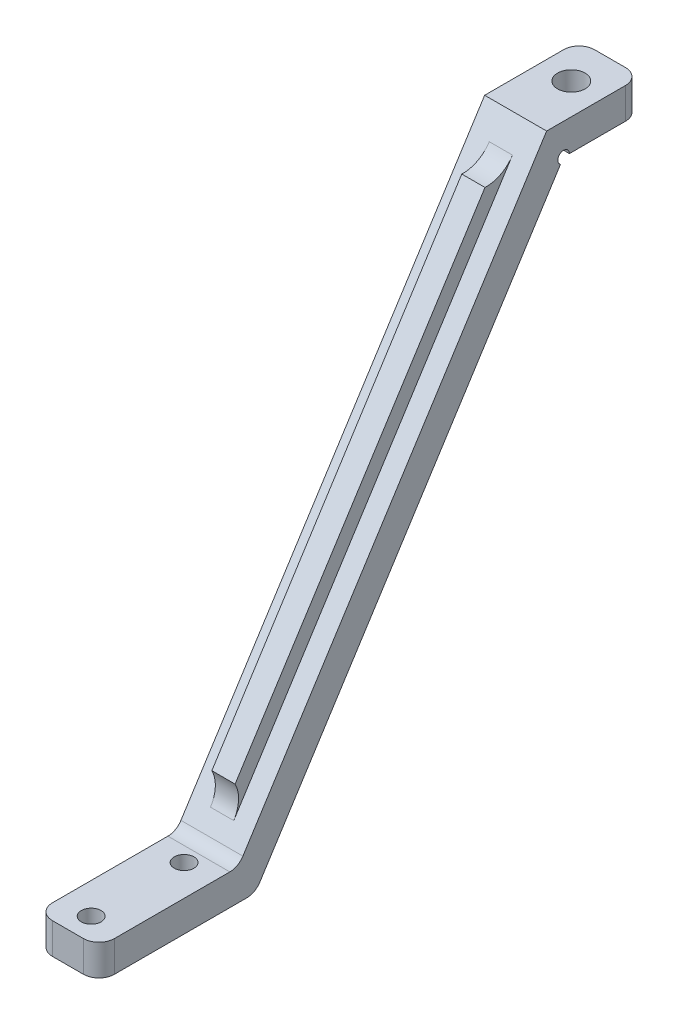
ISO-10303-21;
HEADER;
FILE_DESCRIPTION(('STEP AP214'),'2;1');
FILE_NAME('part.step','',(''),(''),'','','');
FILE_SCHEMA(('AUTOMOTIVE_DESIGN { 1 0 10303 214 1 1 1 1 }'));
ENDSEC;
DATA;
#1=APPLICATION_CONTEXT('core data for automotive mechanical design processes');
#2=APPLICATION_PROTOCOL_DEFINITION('international standard','automotive_design',2000,#1);
#3=PRODUCT_CONTEXT('',#1,'mechanical');
#4=PRODUCT('Part','Part','',(#3));
#5=PRODUCT_RELATED_PRODUCT_CATEGORY('part','',(#4));
#6=PRODUCT_DEFINITION_FORMATION('','',#4);
#7=PRODUCT_DEFINITION_CONTEXT('part definition',#1,'design');
#8=PRODUCT_DEFINITION('design','',#6,#7);
#9=PRODUCT_DEFINITION_SHAPE('','',#8);
#10=(LENGTH_UNIT() NAMED_UNIT(*) SI_UNIT(.MILLI.,.METRE.));
#11=(NAMED_UNIT(*) PLANE_ANGLE_UNIT() SI_UNIT($,.RADIAN.));
#12=(NAMED_UNIT(*) SI_UNIT($,.STERADIAN.) SOLID_ANGLE_UNIT());
#13=UNCERTAINTY_MEASURE_WITH_UNIT(LENGTH_MEASURE(1.E-05),#10,'distance_accuracy_value','');
#14=(GEOMETRIC_REPRESENTATION_CONTEXT(3) GLOBAL_UNCERTAINTY_ASSIGNED_CONTEXT((#13)) GLOBAL_UNIT_ASSIGNED_CONTEXT((#10,
#11,#12)) REPRESENTATION_CONTEXT('',''));
#15=CARTESIAN_POINT('',(0.,0.,0.));
#16=DIRECTION('',(0.,0.,1.));
#17=DIRECTION('',(1.,0.,0.));
#18=AXIS2_PLACEMENT_3D('',#15,#16,#17);
#19=CARTESIAN_POINT('',(4.,58.4,-42.));
#20=DIRECTION('',(0.,0.537817877143923,0.843061048219169));
#21=DIRECTION('',(0.,-0.843061048219169,0.537817877143923));
#22=AXIS2_PLACEMENT_3D('',#19,#20,#21);
#23=PLANE('',#22);
#24=DIRECTION('',(0.,0.843061048219169,-0.537817877143923));
#25=VECTOR('',#24,1.);
#26=CARTESIAN_POINT('',(4.,58.4,-42.));
#27=LINE('',#26,#25);
#28=CARTESIAN_POINT('',(4.,-3.07563575428783,-2.78256018673409));
#29=VERTEX_POINT('',#28);
#30=CARTESIAN_POINT('',(4.,57.7677042138356,-41.5966365921421));
#31=VERTEX_POINT('',#30);
#32=EDGE_CURVE('E431',#29,#31,#27,.T.);
#33=ORIENTED_EDGE('',*,*,#32,.F.);
#34=DIRECTION('',(-1.,0.,0.));
#35=VECTOR('',#34,1.);
#36=CARTESIAN_POINT('',(4.,-3.07563575428783,-2.78256018673409));
#37=LINE('',#36,#35);
#38=CARTESIAN_POINT('',(-4.,-3.07563575428783,-2.78256018673409));
#39=VERTEX_POINT('',#38);
#40=EDGE_CURVE('E385',#29,#39,#37,.T.);
#41=ORIENTED_EDGE('',*,*,#40,.T.);
#42=DIRECTION('',(0.,0.843061048219169,-0.537817877143923));
#43=VECTOR('',#42,1.);
#44=CARTESIAN_POINT('',(-4.,58.4,-42.));
#45=LINE('',#44,#43);
#46=CARTESIAN_POINT('',(-4.,57.7677042138356,-41.5966365921421));
#47=VERTEX_POINT('',#46);
#48=EDGE_CURVE('E228',#39,#47,#45,.T.);
#49=ORIENTED_EDGE('',*,*,#48,.T.);
#50=DIRECTION('',(1.,0.,0.));
#51=VECTOR('',#50,1.);
#52=CARTESIAN_POINT('',(-4.,57.7677042138356,-41.5966365921421));
#53=LINE('',#52,#51);
#54=EDGE_CURVE('E207',#47,#31,#53,.T.);
#55=ORIENTED_EDGE('',*,*,#54,.T.);
#56=EDGE_LOOP('',(#33,#41,#49,#55));
#57=FACE_BOUND('',#56,.T.);
#58=DIRECTION('',(0.,-0.843061048219169,0.537817877143923));
#59=VECTOR('',#58,1.);
#60=CARTESIAN_POINT('',(-1.5,3.75689704484922,-7.14126978826324));
#61=LINE('',#60,#59);
#62=CARTESIAN_POINT('',(-1.5,57.2610090767951,-41.2733981937629));
#63=VERTEX_POINT('',#62);
#64=CARTESIAN_POINT('',(-1.5,0.836447906053474,-5.27821401139901));
#65=VERTEX_POINT('',#64);
#66=EDGE_CURVE('E475',#63,#65,#61,.T.);
#67=ORIENTED_EDGE('',*,*,#66,.T.);
#68=DIRECTION('',(1.,0.,0.));
#69=VECTOR('',#68,1.);
#70=CARTESIAN_POINT('',(4.,0.836447906053466,-5.27821401139901));
#71=LINE('',#70,#69);
#72=CARTESIAN_POINT('',(1.5,0.836447906053471,-5.27821401139902));
#73=VERTEX_POINT('',#72);
#74=EDGE_CURVE('E285',#65,#73,#71,.T.);
#75=ORIENTED_EDGE('',*,*,#74,.T.);
#76=DIRECTION('',(0.,-0.843061048219169,0.537817877143923));
#77=VECTOR('',#76,1.);
#78=CARTESIAN_POINT('',(1.5,3.75689704484922,-7.14126978826324));
#79=LINE('',#78,#77);
#80=CARTESIAN_POINT('',(1.5,57.2610090767952,-41.2733981937629));
#81=VERTEX_POINT('',#80);
#82=EDGE_CURVE('E476',#81,#73,#79,.T.);
#83=ORIENTED_EDGE('',*,*,#82,.F.);
#84=DIRECTION('',(-1.,0.,0.));
#85=VECTOR('',#84,1.);
#86=CARTESIAN_POINT('',(4.,57.2610090767951,-41.2733981937629));
#87=LINE('',#86,#85);
#88=EDGE_CURVE('E266',#81,#63,#87,.T.);
#89=ORIENTED_EDGE('',*,*,#88,.T.);
#90=EDGE_LOOP('',(#67,#75,#83,#89));
#91=FACE_BOUND('',#90,.T.);
#92=ADVANCED_FACE('F43',(#57,#91),#23,.F.);
#93=CARTESIAN_POINT('',(4.,0.,0.));
#94=DIRECTION('',(0.,-0.537817877143923,-0.843061048219169));
#95=DIRECTION('',(0.,0.843061048219169,-0.537817877143923));
#96=AXIS2_PLACEMENT_3D('',#93,#94,#95);
#97=PLANE('',#96);
#98=DIRECTION('',(0.,-0.843061048219169,0.537817877143923));
#99=VECTOR('',#98,1.);
#100=CARTESIAN_POINT('',(-4.,0.,0.));
#101=LINE('',#100,#99);
#102=CARTESIAN_POINT('',(-4.,62.4,-39.8071238194085));
#103=VERTEX_POINT('',#102);
#104=CARTESIAN_POINT('',(-4.,0.924364245712154,-0.589684006142594));
#105=VERTEX_POINT('',#104);
#106=EDGE_CURVE('E232',#103,#105,#101,.T.);
#107=ORIENTED_EDGE('',*,*,#106,.T.);
#108=DIRECTION('',(-1.,0.,0.));
#109=VECTOR('',#108,1.);
#110=CARTESIAN_POINT('',(4.,0.924364245712154,-0.589684006142594));
#111=LINE('',#110,#109);
#112=CARTESIAN_POINT('',(4.,0.924364245712154,-0.589684006142594));
#113=VERTEX_POINT('',#112);
#114=EDGE_CURVE('E382',#105,#113,#111,.F.);
#115=ORIENTED_EDGE('',*,*,#114,.T.);
#116=DIRECTION('',(0.,-0.843061048219169,0.537817877143923));
#117=VECTOR('',#116,1.);
#118=CARTESIAN_POINT('',(4.,0.,0.));
#119=LINE('',#118,#117);
#120=CARTESIAN_POINT('',(4.,62.4,-39.8071238194085));
#121=VERTEX_POINT('',#120);
#122=EDGE_CURVE('E412',#121,#113,#119,.T.);
#123=ORIENTED_EDGE('',*,*,#122,.F.);
#124=DIRECTION('',(-1.,0.,0.));
#125=VECTOR('',#124,1.);
#126=CARTESIAN_POINT('',(4.,62.4,-39.8071238194085));
#127=LINE('',#126,#125);
#128=EDGE_CURVE('E249',#121,#103,#127,.T.);
#129=ORIENTED_EDGE('',*,*,#128,.T.);
#130=EDGE_LOOP('',(#107,#115,#123,#129));
#131=FACE_BOUND('',#130,.T.);
#132=DIRECTION('',(-1.,0.,0.));
#133=VECTOR('',#132,1.);
#134=CARTESIAN_POINT('',(4.,2.98771941462919,-1.90596981852236));
#135=LINE('',#134,#133);
#136=CARTESIAN_POINT('',(1.5,2.9877194146292,-1.90596981852235));
#137=VERTEX_POINT('',#136);
#138=CARTESIAN_POINT('',(-1.5,2.98771941462919,-1.90596981852236));
#139=VERTEX_POINT('',#138);
#140=EDGE_CURVE('E293',#137,#139,#135,.T.);
#141=ORIENTED_EDGE('',*,*,#140,.T.);
#142=DIRECTION('',(0.,0.843061048219169,-0.537817877143923));
#143=VECTOR('',#142,1.);
#144=CARTESIAN_POINT('',(-1.5,56.4918314465751,-36.0380982240219));
#145=LINE('',#144,#143);
#146=CARTESIAN_POINT('',(-1.5,59.4122805853708,-37.9011540008862));
#147=VERTEX_POINT('',#146);
#148=EDGE_CURVE('E479',#139,#147,#145,.T.);
#149=ORIENTED_EDGE('',*,*,#148,.T.);
#150=DIRECTION('',(1.,0.,0.));
#151=VECTOR('',#150,1.);
#152=CARTESIAN_POINT('',(4.,59.4122805853708,-37.9011540008862));
#153=LINE('',#152,#151);
#154=CARTESIAN_POINT('',(1.5,59.4122805853708,-37.9011540008862));
#155=VERTEX_POINT('',#154);
#156=EDGE_CURVE('E289',#147,#155,#153,.T.);
#157=ORIENTED_EDGE('',*,*,#156,.T.);
#158=DIRECTION('',(0.,0.843061048219169,-0.537817877143923));
#159=VECTOR('',#158,1.);
#160=CARTESIAN_POINT('',(1.5,56.4918314465751,-36.0380982240219));
#161=LINE('',#160,#159);
#162=EDGE_CURVE('E484',#137,#155,#161,.T.);
#163=ORIENTED_EDGE('',*,*,#162,.F.);
#164=EDGE_LOOP('',(#141,#149,#157,#163));
#165=FACE_BOUND('',#164,.T.);
#166=ADVANCED_FACE('F402',(#131,#165),#97,.F.);
#167=CARTESIAN_POINT('',(4.,-4.,18.));
#168=DIRECTION('',(0.,0.,-1.));
#169=DIRECTION('',(-1.,0.,0.));
#170=AXIS2_PLACEMENT_3D('',#167,#168,#169);
#171=PLANE('',#170);
#172=DIRECTION('',(-1.,0.,0.));
#173=VECTOR('',#172,1.);
#174=CARTESIAN_POINT('',(4.,0.,18.));
#175=LINE('',#174,#173);
#176=CARTESIAN_POINT('',(2.,0.,18.));
#177=VERTEX_POINT('',#176);
#178=CARTESIAN_POINT('',(-2.,0.,18.));
#179=VERTEX_POINT('',#178);
#180=EDGE_CURVE('E245',#177,#179,#175,.T.);
#181=ORIENTED_EDGE('',*,*,#180,.T.);
#182=DIRECTION('',(0.,-1.,0.));
#183=VECTOR('',#182,1.);
#184=CARTESIAN_POINT('',(-2.,-4.,18.));
#185=LINE('',#184,#183);
#186=CARTESIAN_POINT('',(-2.,-4.,18.));
#187=VERTEX_POINT('',#186);
#188=EDGE_CURVE('E328',#179,#187,#185,.T.);
#189=ORIENTED_EDGE('',*,*,#188,.T.);
#190=DIRECTION('',(-1.,0.,0.));
#191=VECTOR('',#190,1.);
#192=CARTESIAN_POINT('',(4.,-4.,18.));
#193=LINE('',#192,#191);
#194=CARTESIAN_POINT('',(2.,-4.,18.));
#195=VERTEX_POINT('',#194);
#196=EDGE_CURVE('E262',#195,#187,#193,.T.);
#197=ORIENTED_EDGE('',*,*,#196,.F.);
#198=DIRECTION('',(0.,-1.,0.));
#199=VECTOR('',#198,1.);
#200=CARTESIAN_POINT('',(2.,-4.,18.));
#201=LINE('',#200,#199);
#202=EDGE_CURVE('E325',#195,#177,#201,.F.);
#203=ORIENTED_EDGE('',*,*,#202,.T.);
#204=EDGE_LOOP('',(#181,#189,#197,#203));
#205=FACE_BOUND('',#204,.T.);
#206=ADVANCED_FACE('F538',(#205),#171,.F.);
#207=CARTESIAN_POINT('',(4.,-4.,-2.19287618059149));
#208=DIRECTION('',(0.,1.,0.));
#209=DIRECTION('',(0.,0.,1.));
#210=AXIS2_PLACEMENT_3D('',#207,#208,#209);
#211=PLANE('',#210);
#212=CARTESIAN_POINT('',(0.,-4.,3.));
#213=DIRECTION('',(0.,1.,0.));
#214=DIRECTION('',(0.,0.,1.));
#215=AXIS2_PLACEMENT_3D('',#212,#213,#214);
#216=CIRCLE('',#215,1.275);
#217=CARTESIAN_POINT('',(0.,-4.,4.275));
#218=VERTEX_POINT('',#217);
#219=EDGE_CURVE('E272',#218,#218,#216,.T.);
#220=ORIENTED_EDGE('',*,*,#219,.T.);
#221=EDGE_LOOP('',(#220));
#222=FACE_BOUND('',#221,.T.);
#223=CARTESIAN_POINT('',(0.,-4.,15.));
#224=DIRECTION('',(0.,1.,0.));
#225=DIRECTION('',(0.,0.,1.));
#226=AXIS2_PLACEMENT_3D('',#223,#224,#225);
#227=CIRCLE('',#226,1.275);
#228=CARTESIAN_POINT('',(0.,-4.,16.275));
#229=VERTEX_POINT('',#228);
#230=EDGE_CURVE('E506',#229,#229,#227,.T.);
#231=ORIENTED_EDGE('',*,*,#230,.T.);
#232=EDGE_LOOP('',(#231));
#233=FACE_BOUND('',#232,.T.);
#234=DIRECTION('',(0.,0.,-1.));
#235=VECTOR('',#234,1.);
#236=CARTESIAN_POINT('',(-4.,-4.,-2.19287618059149));
#237=LINE('',#236,#235);
#238=CARTESIAN_POINT('',(-4.,-4.,16.));
#239=VERTEX_POINT('',#238);
#240=CARTESIAN_POINT('',(-4.,-4.,-1.09643809029575));
#241=VERTEX_POINT('',#240);
#242=EDGE_CURVE('E234',#239,#241,#237,.T.);
#243=ORIENTED_EDGE('',*,*,#242,.T.);
#244=DIRECTION('',(-1.,0.,0.));
#245=VECTOR('',#244,1.);
#246=CARTESIAN_POINT('',(4.,-4.,-1.09643809029575));
#247=LINE('',#246,#245);
#248=CARTESIAN_POINT('',(4.,-4.,-1.09643809029575));
#249=VERTEX_POINT('',#248);
#250=EDGE_CURVE('E59',#241,#249,#247,.F.);
#251=ORIENTED_EDGE('',*,*,#250,.T.);
#252=DIRECTION('',(0.,0.,-1.));
#253=VECTOR('',#252,1.);
#254=CARTESIAN_POINT('',(4.,-4.,-2.19287618059149));
#255=LINE('',#254,#253);
#256=CARTESIAN_POINT('',(4.,-4.,16.));
#257=VERTEX_POINT('',#256);
#258=EDGE_CURVE('E244',#257,#249,#255,.T.);
#259=ORIENTED_EDGE('',*,*,#258,.F.);
#260=CARTESIAN_POINT('',(2.,-4.,16.));
#261=DIRECTION('',(0.,1.,0.));
#262=DIRECTION('',(0.,0.,1.));
#263=AXIS2_PLACEMENT_3D('',#260,#261,#262);
#264=CIRCLE('',#263,2.);
#265=EDGE_CURVE('E332',#257,#195,#264,.F.);
#266=ORIENTED_EDGE('',*,*,#265,.T.);
#267=ORIENTED_EDGE('',*,*,#196,.T.);
#268=CARTESIAN_POINT('',(-2.,-4.,16.));
#269=DIRECTION('',(0.,1.,0.));
#270=DIRECTION('',(0.,0.,1.));
#271=AXIS2_PLACEMENT_3D('',#268,#269,#270);
#272=CIRCLE('',#271,2.);
#273=EDGE_CURVE('E335',#187,#239,#272,.F.);
#274=ORIENTED_EDGE('',*,*,#273,.T.);
#275=EDGE_LOOP('',(#243,#251,#259,#266,#267,#274));
#276=FACE_BOUND('',#275,.T.);
#277=ADVANCED_FACE('F425',(#222,#233,#276),#211,.F.);
#278=CARTESIAN_POINT('',(4.,58.4,-52.));
#279=DIRECTION('',(0.,1.,0.));
#280=DIRECTION('',(0.,0.,1.));
#281=AXIS2_PLACEMENT_3D('',#278,#279,#280);
#282=PLANE('',#281);
#283=CARTESIAN_POINT('',(-4.71844785465692E-13,58.4,-46.9999999999993));
#284=DIRECTION('',(0.,1.,0.));
#285=DIRECTION('',(0.,0.,1.));
#286=AXIS2_PLACEMENT_3D('',#283,#284,#285);
#287=CIRCLE('',#286,1.7749999999994);
#288=CARTESIAN_POINT('',(-4.71844785465692E-13,58.4,-45.2249999999999));
#289=VERTEX_POINT('',#288);
#290=EDGE_CURVE('E280',#289,#289,#287,.T.);
#291=ORIENTED_EDGE('',*,*,#290,.T.);
#292=EDGE_LOOP('',(#291));
#293=FACE_BOUND('',#292,.T.);
#294=DIRECTION('',(0.,0.,-1.));
#295=VECTOR('',#294,1.);
#296=CARTESIAN_POINT('',(-4.,58.4,-52.));
#297=LINE('',#296,#295);
#298=CARTESIAN_POINT('',(-4.,58.4,-42.75));
#299=VERTEX_POINT('',#298);
#300=CARTESIAN_POINT('',(-4.,58.4,-50.));
#301=VERTEX_POINT('',#300);
#302=EDGE_CURVE('E216',#299,#301,#297,.T.);
#303=ORIENTED_EDGE('',*,*,#302,.T.);
#304=CARTESIAN_POINT('',(-2.,58.4,-50.));
#305=DIRECTION('',(0.,1.,0.));
#306=DIRECTION('',(0.,0.,1.));
#307=AXIS2_PLACEMENT_3D('',#304,#305,#306);
#308=CIRCLE('',#307,2.);
#309=CARTESIAN_POINT('',(-2.,58.4,-52.));
#310=VERTEX_POINT('',#309);
#311=EDGE_CURVE('E375',#301,#310,#308,.F.);
#312=ORIENTED_EDGE('',*,*,#311,.T.);
#313=DIRECTION('',(-1.,0.,0.));
#314=VECTOR('',#313,1.);
#315=CARTESIAN_POINT('',(4.,58.4,-52.));
#316=LINE('',#315,#314);
#317=CARTESIAN_POINT('',(2.,58.4,-52.));
#318=VERTEX_POINT('',#317);
#319=EDGE_CURVE('E258',#318,#310,#316,.T.);
#320=ORIENTED_EDGE('',*,*,#319,.F.);
#321=CARTESIAN_POINT('',(2.,58.4,-50.));
#322=DIRECTION('',(0.,1.,0.));
#323=DIRECTION('',(0.,0.,1.));
#324=AXIS2_PLACEMENT_3D('',#321,#322,#323);
#325=CIRCLE('',#324,2.);
#326=CARTESIAN_POINT('',(4.,58.4,-50.));
#327=VERTEX_POINT('',#326);
#328=EDGE_CURVE('E372',#318,#327,#325,.F.);
#329=ORIENTED_EDGE('',*,*,#328,.T.);
#330=DIRECTION('',(0.,0.,-1.));
#331=VECTOR('',#330,1.);
#332=CARTESIAN_POINT('',(4.,58.4,-52.));
#333=LINE('',#332,#331);
#334=CARTESIAN_POINT('',(4.,58.4,-42.75));
#335=VERTEX_POINT('',#334);
#336=EDGE_CURVE('E219',#335,#327,#333,.T.);
#337=ORIENTED_EDGE('',*,*,#336,.F.);
#338=DIRECTION('',(1.,0.,0.));
#339=VECTOR('',#338,1.);
#340=CARTESIAN_POINT('',(-4.,58.4,-42.75));
#341=LINE('',#340,#339);
#342=EDGE_CURVE('E204',#335,#299,#341,.F.);
#343=ORIENTED_EDGE('',*,*,#342,.T.);
#344=EDGE_LOOP('',(#303,#312,#320,#329,#337,#343));
#345=FACE_BOUND('',#344,.T.);
#346=ADVANCED_FACE('F215',(#293,#345),#282,.F.);
#347=CARTESIAN_POINT('',(4.,62.4000000000001,-52.));
#348=DIRECTION('',(0.,0.,1.));
#349=DIRECTION('',(1.,0.,0.));
#350=AXIS2_PLACEMENT_3D('',#347,#348,#349);
#351=PLANE('',#350);
#352=ORIENTED_EDGE('',*,*,#319,.T.);
#353=DIRECTION('',(0.,1.,0.));
#354=VECTOR('',#353,1.);
#355=CARTESIAN_POINT('',(-2.,62.4000000000001,-52.));
#356=LINE('',#355,#354);
#357=CARTESIAN_POINT('',(-2.,62.4000000000001,-52.));
#358=VERTEX_POINT('',#357);
#359=EDGE_CURVE('E362',#310,#358,#356,.T.);
#360=ORIENTED_EDGE('',*,*,#359,.T.);
#361=DIRECTION('',(-1.,0.,0.));
#362=VECTOR('',#361,1.);
#363=CARTESIAN_POINT('',(4.,62.4000000000001,-52.));
#364=LINE('',#363,#362);
#365=CARTESIAN_POINT('',(2.,62.4000000000001,-52.));
#366=VERTEX_POINT('',#365);
#367=EDGE_CURVE('E254',#366,#358,#364,.T.);
#368=ORIENTED_EDGE('',*,*,#367,.F.);
#369=DIRECTION('',(0.,1.,0.));
#370=VECTOR('',#369,1.);
#371=CARTESIAN_POINT('',(2.,62.4000000000001,-52.));
#372=LINE('',#371,#370);
#373=EDGE_CURVE('E359',#366,#318,#372,.F.);
#374=ORIENTED_EDGE('',*,*,#373,.T.);
#375=EDGE_LOOP('',(#352,#360,#368,#374));
#376=FACE_BOUND('',#375,.T.);
#377=ADVANCED_FACE('F452',(#376),#351,.F.);
#378=CARTESIAN_POINT('',(4.,62.4,-39.8071238194085));
#379=DIRECTION('',(0.,-1.,0.));
#380=DIRECTION('',(0.,0.,-1.));
#381=AXIS2_PLACEMENT_3D('',#378,#379,#380);
#382=PLANE('',#381);
#383=CARTESIAN_POINT('',(-4.71844785465692E-13,62.4,-46.9999999999993));
#384=DIRECTION('',(0.,-1.,0.));
#385=DIRECTION('',(0.,0.,-1.));
#386=AXIS2_PLACEMENT_3D('',#383,#384,#385);
#387=CIRCLE('',#386,1.7749999999994);
#388=CARTESIAN_POINT('',(-4.71844785465692E-13,62.4,-48.7749999999987));
#389=VERTEX_POINT('',#388);
#390=EDGE_CURVE('E276',#389,#389,#387,.T.);
#391=ORIENTED_EDGE('',*,*,#390,.T.);
#392=EDGE_LOOP('',(#391));
#393=FACE_BOUND('',#392,.T.);
#394=ORIENTED_EDGE('',*,*,#367,.T.);
#395=CARTESIAN_POINT('',(-2.,62.4,-50.));
#396=DIRECTION('',(0.,-1.,0.));
#397=DIRECTION('',(0.,0.,-1.));
#398=AXIS2_PLACEMENT_3D('',#395,#396,#397);
#399=CIRCLE('',#398,2.);
#400=CARTESIAN_POINT('',(-4.,62.4,-50.));
#401=VERTEX_POINT('',#400);
#402=EDGE_CURVE('E369',#358,#401,#399,.F.);
#403=ORIENTED_EDGE('',*,*,#402,.T.);
#404=DIRECTION('',(0.,0.,1.));
#405=VECTOR('',#404,1.);
#406=CARTESIAN_POINT('',(-4.,62.4,-39.8071238194085));
#407=LINE('',#406,#405);
#408=EDGE_CURVE('E227',#401,#103,#407,.T.);
#409=ORIENTED_EDGE('',*,*,#408,.T.);
#410=ORIENTED_EDGE('',*,*,#128,.F.);
#411=DIRECTION('',(0.,0.,1.));
#412=VECTOR('',#411,1.);
#413=CARTESIAN_POINT('',(4.,62.4,-39.8071238194085));
#414=LINE('',#413,#412);
#415=CARTESIAN_POINT('',(4.,62.4,-50.));
#416=VERTEX_POINT('',#415);
#417=EDGE_CURVE('E421',#416,#121,#414,.T.);
#418=ORIENTED_EDGE('',*,*,#417,.F.);
#419=CARTESIAN_POINT('',(2.,62.4,-50.));
#420=DIRECTION('',(0.,-1.,0.));
#421=DIRECTION('',(0.,0.,-1.));
#422=AXIS2_PLACEMENT_3D('',#419,#420,#421);
#423=CIRCLE('',#422,2.);
#424=EDGE_CURVE('E366',#416,#366,#423,.F.);
#425=ORIENTED_EDGE('',*,*,#424,.T.);
#426=EDGE_LOOP('',(#394,#403,#409,#410,#418,#425));
#427=FACE_BOUND('',#426,.T.);
#428=ADVANCED_FACE('F445',(#393,#427),#382,.F.);
#429=CARTESIAN_POINT('',(4.,0.,18.));
#430=DIRECTION('',(0.,-1.,0.));
#431=DIRECTION('',(0.,0.,-1.));
#432=AXIS2_PLACEMENT_3D('',#429,#430,#431);
#433=PLANE('',#432);
#434=CARTESIAN_POINT('',(0.,0.,3.));
#435=DIRECTION('',(0.,-1.,0.));
#436=DIRECTION('',(0.,0.,-1.));
#437=AXIS2_PLACEMENT_3D('',#434,#435,#436);
#438=CIRCLE('',#437,1.275);
#439=CARTESIAN_POINT('',(0.,0.,1.725));
#440=VERTEX_POINT('',#439);
#441=EDGE_CURVE('E271',#440,#440,#438,.T.);
#442=ORIENTED_EDGE('',*,*,#441,.T.);
#443=EDGE_LOOP('',(#442));
#444=FACE_BOUND('',#443,.T.);
#445=CARTESIAN_POINT('',(0.,0.,15.));
#446=DIRECTION('',(0.,-1.,0.));
#447=DIRECTION('',(0.,0.,-1.));
#448=AXIS2_PLACEMENT_3D('',#445,#446,#447);
#449=CIRCLE('',#448,1.275);
#450=CARTESIAN_POINT('',(0.,0.,13.725));
#451=VERTEX_POINT('',#450);
#452=EDGE_CURVE('E267',#451,#451,#449,.T.);
#453=ORIENTED_EDGE('',*,*,#452,.T.);
#454=EDGE_LOOP('',(#453));
#455=FACE_BOUND('',#454,.T.);
#456=DIRECTION('',(0.,0.,1.));
#457=VECTOR('',#456,1.);
#458=CARTESIAN_POINT('',(4.,0.,18.));
#459=LINE('',#458,#457);
#460=CARTESIAN_POINT('',(4.,0.,1.09643809029574));
#461=VERTEX_POINT('',#460);
#462=CARTESIAN_POINT('',(4.,0.,16.));
#463=VERTEX_POINT('',#462);
#464=EDGE_CURVE('E250',#461,#463,#459,.T.);
#465=ORIENTED_EDGE('',*,*,#464,.F.);
#466=DIRECTION('',(-1.,0.,0.));
#467=VECTOR('',#466,1.);
#468=CARTESIAN_POINT('',(-4.,0.,1.09643809029574));
#469=LINE('',#468,#467);
#470=CARTESIAN_POINT('',(-4.,0.,1.09643809029574));
#471=VERTEX_POINT('',#470);
#472=EDGE_CURVE('E378',#461,#471,#469,.T.);
#473=ORIENTED_EDGE('',*,*,#472,.T.);
#474=DIRECTION('',(0.,0.,1.));
#475=VECTOR('',#474,1.);
#476=CARTESIAN_POINT('',(-4.,0.,18.));
#477=LINE('',#476,#475);
#478=CARTESIAN_POINT('',(-4.,0.,16.));
#479=VERTEX_POINT('',#478);
#480=EDGE_CURVE('E241',#471,#479,#477,.T.);
#481=ORIENTED_EDGE('',*,*,#480,.T.);
#482=CARTESIAN_POINT('',(-2.,0.,16.));
#483=DIRECTION('',(0.,-1.,0.));
#484=DIRECTION('',(0.,0.,-1.));
#485=AXIS2_PLACEMENT_3D('',#482,#483,#484);
#486=CIRCLE('',#485,2.);
#487=EDGE_CURVE('E348',#479,#179,#486,.F.);
#488=ORIENTED_EDGE('',*,*,#487,.T.);
#489=ORIENTED_EDGE('',*,*,#180,.F.);
#490=CARTESIAN_POINT('',(2.,0.,16.));
#491=DIRECTION('',(0.,-1.,0.));
#492=DIRECTION('',(0.,0.,-1.));
#493=AXIS2_PLACEMENT_3D('',#490,#491,#492);
#494=CIRCLE('',#493,2.);
#495=EDGE_CURVE('E344',#177,#463,#494,.F.);
#496=ORIENTED_EDGE('',*,*,#495,.T.);
#497=EDGE_LOOP('',(#465,#473,#481,#488,#489,#496));
#498=FACE_BOUND('',#497,.T.);
#499=ADVANCED_FACE('F414',(#444,#455,#498),#433,.F.);
#500=CARTESIAN_POINT('',(4.,0.,0.));
#501=DIRECTION('',(-1.,0.,0.));
#502=DIRECTION('',(0.,0.,1.));
#503=AXIS2_PLACEMENT_3D('',#500,#501,#502);
#504=PLANE('',#503);
#505=ORIENTED_EDGE('',*,*,#258,.T.);
#506=CARTESIAN_POINT('',(4.,-1.99999999999999,-1.09643809029575));
#507=DIRECTION('',(-1.,0.,0.));
#508=DIRECTION('',(0.,0.,1.));
#509=AXIS2_PLACEMENT_3D('',#506,#507,#508);
#510=CIRCLE('',#509,2.);
#511=EDGE_CURVE('E393',#249,#29,#510,.F.);
#512=ORIENTED_EDGE('',*,*,#511,.T.);
#513=ORIENTED_EDGE('',*,*,#32,.T.);
#514=CARTESIAN_POINT('',(4.,58.4,-42.));
#515=DIRECTION('',(-1.,0.,0.));
#516=DIRECTION('',(0.,0.,1.));
#517=AXIS2_PLACEMENT_3D('',#514,#515,#516);
#518=CIRCLE('',#517,0.749999999999999);
#519=EDGE_CURVE('E210',#31,#335,#518,.T.);
#520=ORIENTED_EDGE('',*,*,#519,.T.);
#521=ORIENTED_EDGE('',*,*,#336,.T.);
#522=DIRECTION('',(0.,1.,0.));
#523=VECTOR('',#522,1.);
#524=CARTESIAN_POINT('',(4.,0.,-50.));
#525=LINE('',#524,#523);
#526=EDGE_CURVE('E351',#327,#416,#525,.T.);
#527=ORIENTED_EDGE('',*,*,#526,.T.);
#528=ORIENTED_EDGE('',*,*,#417,.T.);
#529=ORIENTED_EDGE('',*,*,#122,.T.);
#530=CARTESIAN_POINT('',(4.,2.,1.09643809029574));
#531=DIRECTION('',(-1.,0.,0.));
#532=DIRECTION('',(0.,0.,1.));
#533=AXIS2_PLACEMENT_3D('',#530,#531,#532);
#534=CIRCLE('',#533,2.);
#535=EDGE_CURVE('E11',#113,#461,#534,.T.);
#536=ORIENTED_EDGE('',*,*,#535,.T.);
#537=ORIENTED_EDGE('',*,*,#464,.T.);
#538=DIRECTION('',(0.,-1.,0.));
#539=VECTOR('',#538,1.);
#540=CARTESIAN_POINT('',(4.,0.,16.));
#541=LINE('',#540,#539);
#542=EDGE_CURVE('E355',#463,#257,#541,.T.);
#543=ORIENTED_EDGE('',*,*,#542,.T.);
#544=EDGE_LOOP('',(#505,#512,#513,#520,#521,#527,#528,#529,#536,#537,#543));
#545=FACE_BOUND('',#544,.T.);
#546=ADVANCED_FACE('F411',(#545),#504,.F.);
#547=CARTESIAN_POINT('',(-4.,0.,0.));
#548=DIRECTION('',(-1.,0.,0.));
#549=DIRECTION('',(0.,0.,1.));
#550=AXIS2_PLACEMENT_3D('',#547,#548,#549);
#551=PLANE('',#550);
#552=ORIENTED_EDGE('',*,*,#48,.F.);
#553=CARTESIAN_POINT('',(-4.,-1.99999999999999,-1.09643809029575));
#554=DIRECTION('',(-1.,0.,0.));
#555=DIRECTION('',(0.,0.,1.));
#556=AXIS2_PLACEMENT_3D('',#553,#554,#555);
#557=CIRCLE('',#556,2.);
#558=EDGE_CURVE('E67',#39,#241,#557,.T.);
#559=ORIENTED_EDGE('',*,*,#558,.T.);
#560=ORIENTED_EDGE('',*,*,#242,.F.);
#561=DIRECTION('',(0.,-1.,0.));
#562=VECTOR('',#561,1.);
#563=CARTESIAN_POINT('',(-4.,0.,16.));
#564=LINE('',#563,#562);
#565=EDGE_CURVE('E340',#239,#479,#564,.F.);
#566=ORIENTED_EDGE('',*,*,#565,.T.);
#567=ORIENTED_EDGE('',*,*,#480,.F.);
#568=CARTESIAN_POINT('',(-4.,2.,1.09643809029574));
#569=DIRECTION('',(-1.,0.,0.));
#570=DIRECTION('',(0.,0.,1.));
#571=AXIS2_PLACEMENT_3D('',#568,#569,#570);
#572=CIRCLE('',#571,2.);
#573=EDGE_CURVE('E52',#471,#105,#572,.F.);
#574=ORIENTED_EDGE('',*,*,#573,.T.);
#575=ORIENTED_EDGE('',*,*,#106,.F.);
#576=ORIENTED_EDGE('',*,*,#408,.F.);
#577=DIRECTION('',(0.,1.,0.));
#578=VECTOR('',#577,1.);
#579=CARTESIAN_POINT('',(-4.,58.4,-50.));
#580=LINE('',#579,#578);
#581=EDGE_CURVE('E225',#401,#301,#580,.F.);
#582=ORIENTED_EDGE('',*,*,#581,.T.);
#583=ORIENTED_EDGE('',*,*,#302,.F.);
#584=CARTESIAN_POINT('',(-4.,58.4,-42.));
#585=DIRECTION('',(1.,0.,0.));
#586=DIRECTION('',(0.,0.,-1.));
#587=AXIS2_PLACEMENT_3D('',#584,#585,#586);
#588=CIRCLE('',#587,0.749999999999999);
#589=EDGE_CURVE('E200',#299,#47,#588,.T.);
#590=ORIENTED_EDGE('',*,*,#589,.T.);
#591=EDGE_LOOP('',(#552,#559,#560,#566,#567,#574,#575,#576,#582,#583,#590));
#592=FACE_BOUND('',#591,.T.);
#593=ADVANCED_FACE('F222',(#592),#551,.T.);
#594=CARTESIAN_POINT('',(0.,-4.,15.));
#595=DIRECTION('',(0.,1.,0.));
#596=DIRECTION('',(0.,0.,1.));
#597=AXIS2_PLACEMENT_3D('',#594,#595,#596);
#598=CYLINDRICAL_SURFACE('',#597,1.275);
#599=ORIENTED_EDGE('',*,*,#230,.F.);
#600=EDGE_LOOP('',(#599));
#601=FACE_BOUND('',#600,.T.);
#602=ORIENTED_EDGE('',*,*,#452,.F.);
#603=EDGE_LOOP('',(#602));
#604=FACE_BOUND('',#603,.T.);
#605=ADVANCED_FACE('F514',(#601,#604),#598,.F.);
#606=CARTESIAN_POINT('',(0.,-4.,3.));
#607=DIRECTION('',(0.,1.,0.));
#608=DIRECTION('',(0.,0.,1.));
#609=AXIS2_PLACEMENT_3D('',#606,#607,#608);
#610=CYLINDRICAL_SURFACE('',#609,1.275);
#611=ORIENTED_EDGE('',*,*,#219,.F.);
#612=EDGE_LOOP('',(#611));
#613=FACE_BOUND('',#612,.T.);
#614=ORIENTED_EDGE('',*,*,#441,.F.);
#615=EDGE_LOOP('',(#614));
#616=FACE_BOUND('',#615,.T.);
#617=ADVANCED_FACE('F517',(#613,#616),#610,.F.);
#618=CARTESIAN_POINT('',(-4.71844785465692E-13,-4.,-46.9999999999993));
#619=DIRECTION('',(0.,1.,0.));
#620=DIRECTION('',(0.,0.,1.));
#621=AXIS2_PLACEMENT_3D('',#618,#619,#620);
#622=CYLINDRICAL_SURFACE('',#621,1.7749999999994);
#623=ORIENTED_EDGE('',*,*,#390,.F.);
#624=EDGE_LOOP('',(#623));
#625=FACE_BOUND('',#624,.T.);
#626=ORIENTED_EDGE('',*,*,#290,.F.);
#627=EDGE_LOOP('',(#626));
#628=FACE_BOUND('',#627,.T.);
#629=ADVANCED_FACE('F781',(#625,#628),#622,.F.);
#630=CARTESIAN_POINT('',(1.5,6.9838043077128,-2.08290349894823));
#631=DIRECTION('',(0.,-0.537817877143923,-0.843061048219169));
#632=DIRECTION('',(0.,0.843061048219169,-0.537817877143923));
#633=AXIS2_PLACEMENT_3D('',#630,#631,#632);
#634=PLANE('',#633);
#635=DIRECTION('',(0.,-0.843061048219169,0.537817877143923));
#636=VECTOR('',#635,1.);
#637=CARTESIAN_POINT('',(-1.5,6.9838043077128,-2.08290349894823));
#638=LINE('',#637,#636);
#639=CARTESIAN_POINT('',(-1.5,57.5674672008629,-34.3519761275836));
#640=VERTEX_POINT('',#639);
#641=CARTESIAN_POINT('',(-1.5,6.9838043077128,-2.08290349894823));
#642=VERTEX_POINT('',#641);
#643=EDGE_CURVE('E488',#640,#642,#638,.T.);
#644=ORIENTED_EDGE('',*,*,#643,.T.);
#645=DIRECTION('',(-1.,0.,0.));
#646=VECTOR('',#645,1.);
#647=CARTESIAN_POINT('',(1.5,6.9838043077128,-2.08290349894823));
#648=LINE('',#647,#646);
#649=CARTESIAN_POINT('',(1.5,6.9838043077128,-2.08290349894823));
#650=VERTEX_POINT('',#649);
#651=EDGE_CURVE('E491',#650,#642,#648,.T.);
#652=ORIENTED_EDGE('',*,*,#651,.F.);
#653=DIRECTION('',(0.,-0.843061048219169,0.537817877143923));
#654=VECTOR('',#653,1.);
#655=CARTESIAN_POINT('',(1.5,6.9838043077128,-2.08290349894823));
#656=LINE('',#655,#654);
#657=CARTESIAN_POINT('',(1.5,57.5674672008629,-34.3519761275836));
#658=VERTEX_POINT('',#657);
#659=EDGE_CURVE('E487',#658,#650,#656,.T.);
#660=ORIENTED_EDGE('',*,*,#659,.F.);
#661=DIRECTION('',(-1.,0.,0.));
#662=VECTOR('',#661,1.);
#663=CARTESIAN_POINT('',(1.5,57.5674672008629,-34.3519761275836));
#664=LINE('',#663,#662);
#665=EDGE_CURVE('E281',#658,#640,#664,.T.);
#666=ORIENTED_EDGE('',*,*,#665,.T.);
#667=EDGE_LOOP('',(#644,#652,#660,#666));
#668=FACE_BOUND('',#667,.T.);
#669=ADVANCED_FACE('F770',(#668),#634,.F.);
#670=CARTESIAN_POINT('',(1.5,0.,0.));
#671=DIRECTION('',(-1.,0.,0.));
#672=DIRECTION('',(0.,0.,1.));
#673=AXIS2_PLACEMENT_3D('',#670,#671,#672);
#674=PLANE('',#673);
#675=ORIENTED_EDGE('',*,*,#162,.T.);
#676=CARTESIAN_POINT('',(1.5,61.5635520939465,-34.5289098080095));
#677=DIRECTION('',(-1.,0.,0.));
#678=DIRECTION('',(0.,0.,1.));
#679=AXIS2_PLACEMENT_3D('',#676,#677,#678);
#680=CIRCLE('',#679,4.);
#681=EDGE_CURVE('E315',#155,#658,#680,.T.);
#682=ORIENTED_EDGE('',*,*,#681,.T.);
#683=ORIENTED_EDGE('',*,*,#659,.T.);
#684=CARTESIAN_POINT('',(1.5,5.13899092320488,1.46627437435432));
#685=DIRECTION('',(-1.,0.,0.));
#686=DIRECTION('',(0.,0.,1.));
#687=AXIS2_PLACEMENT_3D('',#684,#685,#686);
#688=CIRCLE('',#687,4.);
#689=EDGE_CURVE('E307',#650,#137,#688,.T.);
#690=ORIENTED_EDGE('',*,*,#689,.T.);
#691=EDGE_LOOP('',(#675,#682,#683,#690));
#692=FACE_BOUND('',#691,.T.);
#693=ADVANCED_FACE('F759',(#692),#674,.F.);
#694=CARTESIAN_POINT('',(-1.5,0.,0.));
#695=DIRECTION('',(-1.,0.,0.));
#696=DIRECTION('',(0.,0.,1.));
#697=AXIS2_PLACEMENT_3D('',#694,#695,#696);
#698=PLANE('',#697);
#699=ORIENTED_EDGE('',*,*,#148,.F.);
#700=CARTESIAN_POINT('',(-1.5,5.13899092320488,1.46627437435432));
#701=DIRECTION('',(-1.,0.,0.));
#702=DIRECTION('',(0.,0.,1.));
#703=AXIS2_PLACEMENT_3D('',#700,#701,#702);
#704=CIRCLE('',#703,4.);
#705=EDGE_CURVE('E304',#139,#642,#704,.F.);
#706=ORIENTED_EDGE('',*,*,#705,.T.);
#707=ORIENTED_EDGE('',*,*,#643,.F.);
#708=CARTESIAN_POINT('',(-1.5,61.5635520939465,-34.5289098080095));
#709=DIRECTION('',(-1.,0.,0.));
#710=DIRECTION('',(0.,0.,1.));
#711=AXIS2_PLACEMENT_3D('',#708,#709,#710);
#712=CIRCLE('',#711,4.);
#713=EDGE_CURVE('E311',#640,#147,#712,.F.);
#714=ORIENTED_EDGE('',*,*,#713,.T.);
#715=EDGE_LOOP('',(#699,#706,#707,#714));
#716=FACE_BOUND('',#715,.T.);
#717=ADVANCED_FACE('F748',(#716),#698,.T.);
#718=CARTESIAN_POINT('',(1.5,53.2649241837115,-41.096464513337));
#719=DIRECTION('',(0.,0.537817877143923,0.843061048219169));
#720=DIRECTION('',(0.,-0.843061048219169,0.537817877143923));
#721=AXIS2_PLACEMENT_3D('',#718,#719,#720);
#722=PLANE('',#721);
#723=DIRECTION('',(0.,0.843061048219169,-0.537817877143923));
#724=VECTOR('',#723,1.);
#725=CARTESIAN_POINT('',(-1.5,53.2649241837115,-41.096464513337));
#726=LINE('',#725,#724);
#727=CARTESIAN_POINT('',(-1.5,2.68126129056138,-8.82739188470159));
#728=VERTEX_POINT('',#727);
#729=CARTESIAN_POINT('',(-1.5,53.2649241837115,-41.096464513337));
#730=VERTEX_POINT('',#729);
#731=EDGE_CURVE('E471',#728,#730,#726,.T.);
#732=ORIENTED_EDGE('',*,*,#731,.T.);
#733=DIRECTION('',(-1.,0.,0.));
#734=VECTOR('',#733,1.);
#735=CARTESIAN_POINT('',(1.5,53.2649241837115,-41.096464513337));
#736=LINE('',#735,#734);
#737=CARTESIAN_POINT('',(1.5,53.2649241837115,-41.096464513337));
#738=VERTEX_POINT('',#737);
#739=EDGE_CURVE('E466',#738,#730,#736,.T.);
#740=ORIENTED_EDGE('',*,*,#739,.F.);
#741=DIRECTION('',(0.,0.843061048219169,-0.537817877143923));
#742=VECTOR('',#741,1.);
#743=CARTESIAN_POINT('',(1.5,53.2649241837115,-41.096464513337));
#744=LINE('',#743,#742);
#745=CARTESIAN_POINT('',(1.5,2.68126129056138,-8.82739188470159));
#746=VERTEX_POINT('',#745);
#747=EDGE_CURVE('E470',#746,#738,#744,.T.);
#748=ORIENTED_EDGE('',*,*,#747,.F.);
#749=DIRECTION('',(-1.,0.,0.));
#750=VECTOR('',#749,1.);
#751=CARTESIAN_POINT('',(1.5,2.68126129056138,-8.82739188470159));
#752=LINE('',#751,#750);
#753=EDGE_CURVE('E462',#746,#728,#752,.T.);
#754=ORIENTED_EDGE('',*,*,#753,.T.);
#755=EDGE_LOOP('',(#732,#740,#748,#754));
#756=FACE_BOUND('',#755,.T.);
#757=ADVANCED_FACE('F737',(#756),#722,.F.);
#758=CARTESIAN_POINT('',(1.5,0.,0.));
#759=DIRECTION('',(-1.,0.,0.));
#760=DIRECTION('',(0.,0.,1.));
#761=AXIS2_PLACEMENT_3D('',#758,#759,#760);
#762=PLANE('',#761);
#763=ORIENTED_EDGE('',*,*,#82,.T.);
#764=CARTESIAN_POINT('',(1.5,-1.31482360252222,-8.65045820427569));
#765=DIRECTION('',(-1.,0.,0.));
#766=DIRECTION('',(0.,0.,1.));
#767=AXIS2_PLACEMENT_3D('',#764,#765,#766);
#768=CIRCLE('',#767,4.);
#769=EDGE_CURVE('E301',#73,#746,#768,.T.);
#770=ORIENTED_EDGE('',*,*,#769,.T.);
#771=ORIENTED_EDGE('',*,*,#747,.T.);
#772=CARTESIAN_POINT('',(1.5,55.1097375682195,-44.6456423866395));
#773=DIRECTION('',(-1.,0.,0.));
#774=DIRECTION('',(0.,0.,1.));
#775=AXIS2_PLACEMENT_3D('',#772,#773,#774);
#776=CIRCLE('',#775,4.);
#777=EDGE_CURVE('E321',#738,#81,#776,.T.);
#778=ORIENTED_EDGE('',*,*,#777,.T.);
#779=EDGE_LOOP('',(#763,#770,#771,#778));
#780=FACE_BOUND('',#779,.T.);
#781=ADVANCED_FACE('F726',(#780),#762,.F.);
#782=CARTESIAN_POINT('',(-1.5,0.,0.));
#783=DIRECTION('',(-1.,0.,0.));
#784=DIRECTION('',(0.,0.,1.));
#785=AXIS2_PLACEMENT_3D('',#782,#783,#784);
#786=PLANE('',#785);
#787=ORIENTED_EDGE('',*,*,#66,.F.);
#788=CARTESIAN_POINT('',(-1.5,55.1097375682195,-44.6456423866395));
#789=DIRECTION('',(-1.,0.,0.));
#790=DIRECTION('',(0.,0.,1.));
#791=AXIS2_PLACEMENT_3D('',#788,#789,#790);
#792=CIRCLE('',#791,4.);
#793=EDGE_CURVE('E318',#63,#730,#792,.F.);
#794=ORIENTED_EDGE('',*,*,#793,.T.);
#795=ORIENTED_EDGE('',*,*,#731,.F.);
#796=CARTESIAN_POINT('',(-1.5,-1.31482360252222,-8.65045820427569));
#797=DIRECTION('',(-1.,0.,0.));
#798=DIRECTION('',(0.,0.,1.));
#799=AXIS2_PLACEMENT_3D('',#796,#797,#798);
#800=CIRCLE('',#799,4.);
#801=EDGE_CURVE('E297',#728,#65,#800,.F.);
#802=ORIENTED_EDGE('',*,*,#801,.T.);
#803=EDGE_LOOP('',(#787,#794,#795,#802));
#804=FACE_BOUND('',#803,.T.);
#805=ADVANCED_FACE('F721',(#804),#786,.T.);
#806=CARTESIAN_POINT('',(-4.,58.4,-42.));
#807=DIRECTION('',(1.,0.,0.));
#808=DIRECTION('',(0.,0.,-1.));
#809=AXIS2_PLACEMENT_3D('',#806,#807,#808);
#810=CYLINDRICAL_SURFACE('',#809,0.749999999999999);
#811=ORIENTED_EDGE('',*,*,#589,.F.);
#812=ORIENTED_EDGE('',*,*,#342,.F.);
#813=ORIENTED_EDGE('',*,*,#519,.F.);
#814=ORIENTED_EDGE('',*,*,#54,.F.);
#815=EDGE_LOOP('',(#811,#812,#813,#814));
#816=FACE_BOUND('',#815,.T.);
#817=ADVANCED_FACE('F202',(#816),#810,.F.);
#818=CARTESIAN_POINT('',(1.5,-1.31482360252222,-8.65045820427569));
#819=DIRECTION('',(1.,0.,0.));
#820=DIRECTION('',(0.,0.,-1.));
#821=AXIS2_PLACEMENT_3D('',#818,#819,#820);
#822=CYLINDRICAL_SURFACE('',#821,4.);
#823=ORIENTED_EDGE('',*,*,#769,.F.);
#824=ORIENTED_EDGE('',*,*,#74,.F.);
#825=ORIENTED_EDGE('',*,*,#801,.F.);
#826=ORIENTED_EDGE('',*,*,#753,.F.);
#827=EDGE_LOOP('',(#823,#824,#825,#826));
#828=FACE_BOUND('',#827,.T.);
#829=ADVANCED_FACE('F548',(#828),#822,.F.);
#830=CARTESIAN_POINT('',(1.5,5.13899092320488,1.46627437435432));
#831=DIRECTION('',(-1.,0.,0.));
#832=DIRECTION('',(0.,0.,1.));
#833=AXIS2_PLACEMENT_3D('',#830,#831,#832);
#834=CYLINDRICAL_SURFACE('',#833,4.);
#835=ORIENTED_EDGE('',*,*,#689,.F.);
#836=ORIENTED_EDGE('',*,*,#651,.T.);
#837=ORIENTED_EDGE('',*,*,#705,.F.);
#838=ORIENTED_EDGE('',*,*,#140,.F.);
#839=EDGE_LOOP('',(#835,#836,#837,#838));
#840=FACE_BOUND('',#839,.T.);
#841=ADVANCED_FACE('F551',(#840),#834,.F.);
#842=CARTESIAN_POINT('',(1.5,61.5635520939465,-34.5289098080095));
#843=DIRECTION('',(1.,0.,0.));
#844=DIRECTION('',(0.,0.,-1.));
#845=AXIS2_PLACEMENT_3D('',#842,#843,#844);
#846=CYLINDRICAL_SURFACE('',#845,4.);
#847=ORIENTED_EDGE('',*,*,#681,.F.);
#848=ORIENTED_EDGE('',*,*,#156,.F.);
#849=ORIENTED_EDGE('',*,*,#713,.F.);
#850=ORIENTED_EDGE('',*,*,#665,.F.);
#851=EDGE_LOOP('',(#847,#848,#849,#850));
#852=FACE_BOUND('',#851,.T.);
#853=ADVANCED_FACE('F555',(#852),#846,.F.);
#854=CARTESIAN_POINT('',(1.5,55.1097375682195,-44.6456423866395));
#855=DIRECTION('',(-1.,0.,0.));
#856=DIRECTION('',(0.,0.,1.));
#857=AXIS2_PLACEMENT_3D('',#854,#855,#856);
#858=CYLINDRICAL_SURFACE('',#857,4.);
#859=ORIENTED_EDGE('',*,*,#777,.F.);
#860=ORIENTED_EDGE('',*,*,#739,.T.);
#861=ORIENTED_EDGE('',*,*,#793,.F.);
#862=ORIENTED_EDGE('',*,*,#88,.F.);
#863=EDGE_LOOP('',(#859,#860,#861,#862));
#864=FACE_BOUND('',#863,.T.);
#865=ADVANCED_FACE('F559',(#864),#858,.F.);
#866=CARTESIAN_POINT('',(-2.,-4.,16.));
#867=DIRECTION('',(0.,1.,0.));
#868=DIRECTION('',(0.,0.,1.));
#869=AXIS2_PLACEMENT_3D('',#866,#867,#868);
#870=CYLINDRICAL_SURFACE('',#869,2.);
#871=ORIENTED_EDGE('',*,*,#487,.F.);
#872=ORIENTED_EDGE('',*,*,#565,.F.);
#873=ORIENTED_EDGE('',*,*,#273,.F.);
#874=ORIENTED_EDGE('',*,*,#188,.F.);
#875=EDGE_LOOP('',(#871,#872,#873,#874));
#876=FACE_BOUND('',#875,.T.);
#877=ADVANCED_FACE('F563',(#876),#870,.T.);
#878=CARTESIAN_POINT('',(2.,0.,16.));
#879=DIRECTION('',(0.,-1.,0.));
#880=DIRECTION('',(0.,0.,-1.));
#881=AXIS2_PLACEMENT_3D('',#878,#879,#880);
#882=CYLINDRICAL_SURFACE('',#881,2.);
#883=ORIENTED_EDGE('',*,*,#495,.F.);
#884=ORIENTED_EDGE('',*,*,#202,.F.);
#885=ORIENTED_EDGE('',*,*,#265,.F.);
#886=ORIENTED_EDGE('',*,*,#542,.F.);
#887=EDGE_LOOP('',(#883,#884,#885,#886));
#888=FACE_BOUND('',#887,.T.);
#889=ADVANCED_FACE('F567',(#888),#882,.T.);
#890=CARTESIAN_POINT('',(-2.,62.4000000000001,-50.));
#891=DIRECTION('',(0.,-1.,0.));
#892=DIRECTION('',(0.,0.,-1.));
#893=AXIS2_PLACEMENT_3D('',#890,#891,#892);
#894=CYLINDRICAL_SURFACE('',#893,2.);
#895=ORIENTED_EDGE('',*,*,#311,.F.);
#896=ORIENTED_EDGE('',*,*,#581,.F.);
#897=ORIENTED_EDGE('',*,*,#402,.F.);
#898=ORIENTED_EDGE('',*,*,#359,.F.);
#899=EDGE_LOOP('',(#895,#896,#897,#898));
#900=FACE_BOUND('',#899,.T.);
#901=ADVANCED_FACE('F447',(#900),#894,.T.);
#902=CARTESIAN_POINT('',(2.,0.,-50.));
#903=DIRECTION('',(0.,1.,0.));
#904=DIRECTION('',(0.,0.,1.));
#905=AXIS2_PLACEMENT_3D('',#902,#903,#904);
#906=CYLINDRICAL_SURFACE('',#905,2.);
#907=ORIENTED_EDGE('',*,*,#328,.F.);
#908=ORIENTED_EDGE('',*,*,#373,.F.);
#909=ORIENTED_EDGE('',*,*,#424,.F.);
#910=ORIENTED_EDGE('',*,*,#526,.F.);
#911=EDGE_LOOP('',(#907,#908,#909,#910));
#912=FACE_BOUND('',#911,.T.);
#913=ADVANCED_FACE('F456',(#912),#906,.T.);
#914=CARTESIAN_POINT('',(4.,2.,1.09643809029574));
#915=DIRECTION('',(1.,0.,0.));
#916=DIRECTION('',(0.,0.,-1.));
#917=AXIS2_PLACEMENT_3D('',#914,#915,#916);
#918=CYLINDRICAL_SURFACE('',#917,2.);
#919=ORIENTED_EDGE('',*,*,#535,.F.);
#920=ORIENTED_EDGE('',*,*,#114,.F.);
#921=ORIENTED_EDGE('',*,*,#573,.F.);
#922=ORIENTED_EDGE('',*,*,#472,.F.);
#923=EDGE_LOOP('',(#919,#920,#921,#922));
#924=FACE_BOUND('',#923,.T.);
#925=ADVANCED_FACE('F408',(#924),#918,.F.);
#926=CARTESIAN_POINT('',(4.,-1.99999999999999,-1.09643809029575));
#927=DIRECTION('',(-1.,0.,0.));
#928=DIRECTION('',(0.,0.,1.));
#929=AXIS2_PLACEMENT_3D('',#926,#927,#928);
#930=CYLINDRICAL_SURFACE('',#929,2.);
#931=ORIENTED_EDGE('',*,*,#511,.F.);
#932=ORIENTED_EDGE('',*,*,#250,.F.);
#933=ORIENTED_EDGE('',*,*,#558,.F.);
#934=ORIENTED_EDGE('',*,*,#40,.F.);
#935=EDGE_LOOP('',(#931,#932,#933,#934));
#936=FACE_BOUND('',#935,.T.);
#937=ADVANCED_FACE('F45',(#936),#930,.T.);
#938=CLOSED_SHELL('',(#92,#166,#206,#277,#346,#377,#428,#499,#546,#593,#605,#617,#629,#669,#693,
#717,#757,#781,#805,#817,#829,#841,#853,#865,#877,#889,#901,#913,#925,#937));
#939=MANIFOLD_SOLID_BREP('B2',#938);
#940=ADVANCED_BREP_SHAPE_REPRESENTATION('',(#18,#939),#14);
#941=SHAPE_DEFINITION_REPRESENTATION(#9,#940);
ENDSEC;
END-ISO-10303-21;
